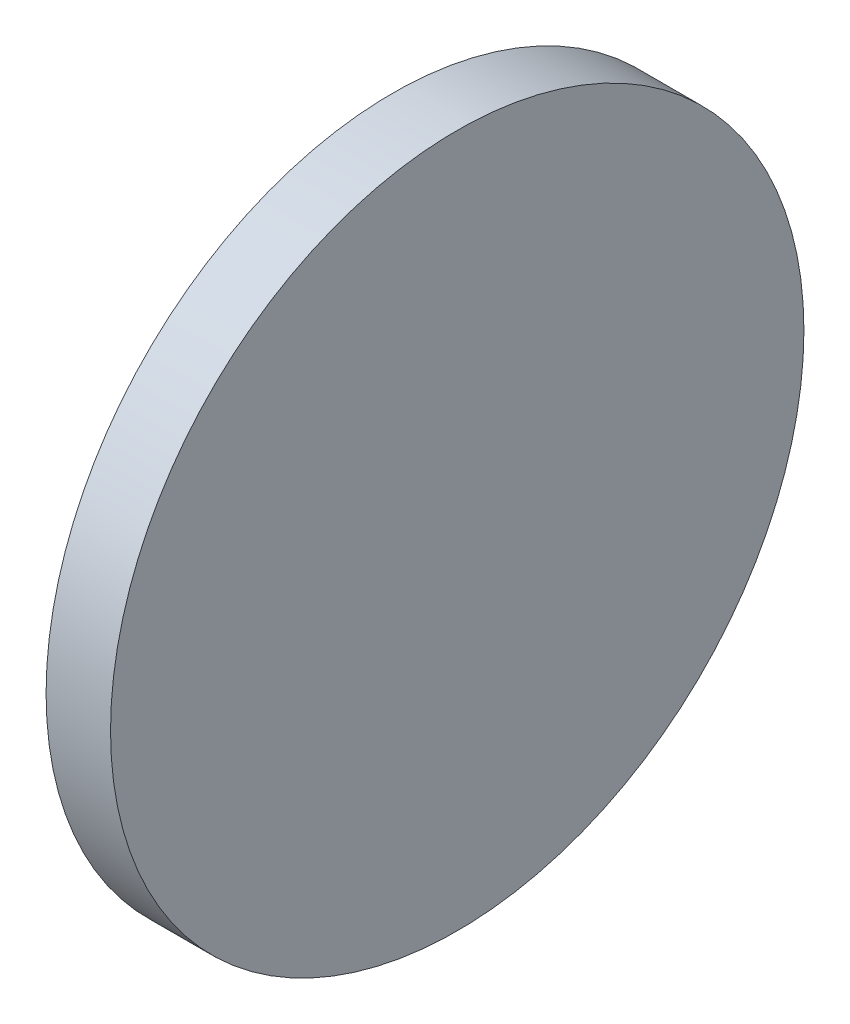
ISO-10303-21;
HEADER;
FILE_DESCRIPTION(('STEP AP214'),'2;1');
FILE_NAME('part.step','',(''),(''),'','','');
FILE_SCHEMA(('AUTOMOTIVE_DESIGN { 1 0 10303 214 1 1 1 1 }'));
ENDSEC;
DATA;
#1=APPLICATION_CONTEXT('core data for automotive mechanical design processes');
#2=APPLICATION_PROTOCOL_DEFINITION('international standard','automotive_design',2000,#1);
#3=PRODUCT_CONTEXT('',#1,'mechanical');
#4=PRODUCT('Part','Part','',(#3));
#5=PRODUCT_RELATED_PRODUCT_CATEGORY('part','',(#4));
#6=PRODUCT_DEFINITION_FORMATION('','',#4);
#7=PRODUCT_DEFINITION_CONTEXT('part definition',#1,'design');
#8=PRODUCT_DEFINITION('design','',#6,#7);
#9=PRODUCT_DEFINITION_SHAPE('','',#8);
#10=(LENGTH_UNIT() NAMED_UNIT(*) SI_UNIT(.MILLI.,.METRE.));
#11=(NAMED_UNIT(*) PLANE_ANGLE_UNIT() SI_UNIT($,.RADIAN.));
#12=(NAMED_UNIT(*) SI_UNIT($,.STERADIAN.) SOLID_ANGLE_UNIT());
#13=UNCERTAINTY_MEASURE_WITH_UNIT(LENGTH_MEASURE(1.E-05),#10,'distance_accuracy_value','');
#14=(GEOMETRIC_REPRESENTATION_CONTEXT(3) GLOBAL_UNCERTAINTY_ASSIGNED_CONTEXT((#13)) GLOBAL_UNIT_ASSIGNED_CONTEXT((#10,
#11,#12)) REPRESENTATION_CONTEXT('',''));
#15=CARTESIAN_POINT('',(0.,0.,0.));
#16=DIRECTION('',(0.,0.,1.));
#17=DIRECTION('',(1.,0.,0.));
#18=AXIS2_PLACEMENT_3D('',#15,#16,#17);
#19=CARTESIAN_POINT('',(-0.7874,0.,-8.4709));
#20=DIRECTION('',(1.,0.,0.));
#21=DIRECTION('',(0.,0.,-1.));
#22=AXIS2_PLACEMENT_3D('',#19,#20,#21);
#23=PLANE('',#22);
#24=CARTESIAN_POINT('',(-0.7874,0.,0.));
#25=DIRECTION('',(-1.,0.,0.));
#26=DIRECTION('',(0.,0.,1.));
#27=AXIS2_PLACEMENT_3D('',#24,#25,#26);
#28=CIRCLE('',#27,8.4709);
#29=CARTESIAN_POINT('',(-0.7874,0.,8.4709));
#30=VERTEX_POINT('',#29);
#31=EDGE_CURVE('E40',#30,#30,#28,.T.);
#32=ORIENTED_EDGE('',*,*,#31,.T.);
#33=EDGE_LOOP('',(#32));
#34=FACE_BOUND('',#33,.T.);
#35=ADVANCED_FACE('F34',(#34),#23,.F.);
#36=CARTESIAN_POINT('',(0.787400000000001,0.,-8.4709));
#37=DIRECTION('',(-1.,0.,0.));
#38=DIRECTION('',(0.,0.,1.));
#39=AXIS2_PLACEMENT_3D('',#36,#37,#38);
#40=PLANE('',#39);
#41=CARTESIAN_POINT('',(0.7874,0.,0.));
#42=DIRECTION('',(-1.,0.,0.));
#43=DIRECTION('',(0.,0.,1.));
#44=AXIS2_PLACEMENT_3D('',#41,#42,#43);
#45=CIRCLE('',#44,8.4709);
#46=CARTESIAN_POINT('',(0.7874,0.,8.4709));
#47=VERTEX_POINT('',#46);
#48=EDGE_CURVE('E10',#47,#47,#45,.T.);
#49=ORIENTED_EDGE('',*,*,#48,.F.);
#50=EDGE_LOOP('',(#49));
#51=FACE_BOUND('',#50,.T.);
#52=ADVANCED_FACE('F49',(#51),#40,.F.);
#53=CARTESIAN_POINT('',(-0.787400000000001,0.,0.));
#54=DIRECTION('',(-1.,0.,0.));
#55=DIRECTION('',(0.,0.,1.));
#56=AXIS2_PLACEMENT_3D('',#53,#54,#55);
#57=CYLINDRICAL_SURFACE('',#56,8.4709);
#58=ORIENTED_EDGE('',*,*,#31,.F.);
#59=EDGE_LOOP('',(#58));
#60=FACE_BOUND('',#59,.T.);
#61=ORIENTED_EDGE('',*,*,#48,.T.);
#62=EDGE_LOOP('',(#61));
#63=FACE_BOUND('',#62,.T.);
#64=ADVANCED_FACE('F47',(#60,#63),#57,.T.);
#65=CLOSED_SHELL('',(#35,#52,#64));
#66=MANIFOLD_SOLID_BREP('B2',#65);
#67=ADVANCED_BREP_SHAPE_REPRESENTATION('',(#18,#66),#14);
#68=SHAPE_DEFINITION_REPRESENTATION(#9,#67);
ENDSEC;
END-ISO-10303-21;
